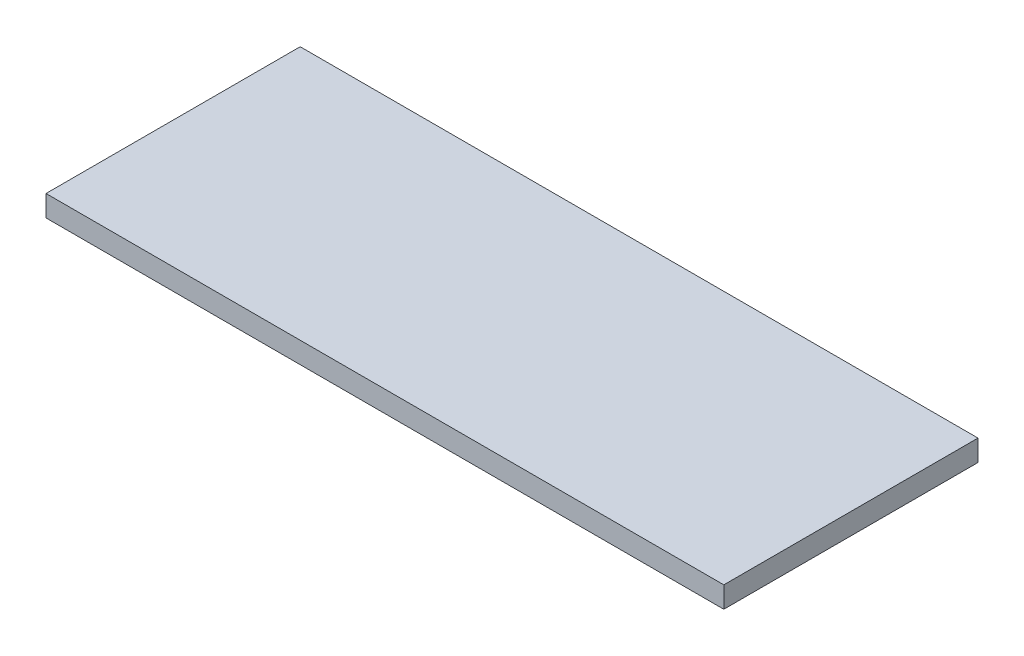
ISO-10303-21;
HEADER;
FILE_DESCRIPTION(('STEP AP214'),'2;1');
FILE_NAME('part.step','',(''),(''),'','','');
FILE_SCHEMA(('AUTOMOTIVE_DESIGN { 1 0 10303 214 1 1 1 1 }'));
ENDSEC;
DATA;
#1=APPLICATION_CONTEXT('core data for automotive mechanical design processes');
#2=APPLICATION_PROTOCOL_DEFINITION('international standard','automotive_design',2000,#1);
#3=PRODUCT_CONTEXT('',#1,'mechanical');
#4=PRODUCT('Part','Part','',(#3));
#5=PRODUCT_RELATED_PRODUCT_CATEGORY('part','',(#4));
#6=PRODUCT_DEFINITION_FORMATION('','',#4);
#7=PRODUCT_DEFINITION_CONTEXT('part definition',#1,'design');
#8=PRODUCT_DEFINITION('design','',#6,#7);
#9=PRODUCT_DEFINITION_SHAPE('','',#8);
#10=(LENGTH_UNIT() NAMED_UNIT(*) SI_UNIT(.MILLI.,.METRE.));
#11=(NAMED_UNIT(*) PLANE_ANGLE_UNIT() SI_UNIT($,.RADIAN.));
#12=(NAMED_UNIT(*) SI_UNIT($,.STERADIAN.) SOLID_ANGLE_UNIT());
#13=UNCERTAINTY_MEASURE_WITH_UNIT(LENGTH_MEASURE(1.E-05),#10,'distance_accuracy_value','');
#14=(GEOMETRIC_REPRESENTATION_CONTEXT(3) GLOBAL_UNCERTAINTY_ASSIGNED_CONTEXT((#13)) GLOBAL_UNIT_ASSIGNED_CONTEXT((#10,
#11,#12)) REPRESENTATION_CONTEXT('',''));
#15=CARTESIAN_POINT('',(0.,0.,0.));
#16=DIRECTION('',(0.,0.,1.));
#17=DIRECTION('',(1.,0.,0.));
#18=AXIS2_PLACEMENT_3D('',#15,#16,#17);
#19=CARTESIAN_POINT('',(0.,19.05,0.));
#20=DIRECTION('',(1.,0.,0.));
#21=DIRECTION('',(0.,0.,-1.));
#22=AXIS2_PLACEMENT_3D('',#19,#20,#21);
#23=PLANE('',#22);
#24=DIRECTION('',(0.,0.,1.));
#25=VECTOR('',#24,1.);
#26=CARTESIAN_POINT('',(0.,0.,0.));
#27=LINE('',#26,#25);
#28=CARTESIAN_POINT('',(1.11022302462516E-13,0.,-228.6));
#29=VERTEX_POINT('',#28);
#30=CARTESIAN_POINT('',(0.,0.,0.));
#31=VERTEX_POINT('',#30);
#32=EDGE_CURVE('E103',#29,#31,#27,.T.);
#33=ORIENTED_EDGE('',*,*,#32,.T.);
#34=DIRECTION('',(0.,-1.,0.));
#35=VECTOR('',#34,1.);
#36=CARTESIAN_POINT('',(0.,19.05,0.));
#37=LINE('',#36,#35);
#38=CARTESIAN_POINT('',(0.,19.05,0.));
#39=VERTEX_POINT('',#38);
#40=EDGE_CURVE('E11',#39,#31,#37,.T.);
#41=ORIENTED_EDGE('',*,*,#40,.F.);
#42=DIRECTION('',(0.,0.,1.));
#43=VECTOR('',#42,1.);
#44=CARTESIAN_POINT('',(0.,19.05,0.));
#45=LINE('',#44,#43);
#46=CARTESIAN_POINT('',(1.11022302462516E-13,19.05,-228.6));
#47=VERTEX_POINT('',#46);
#48=EDGE_CURVE('E86',#47,#39,#45,.T.);
#49=ORIENTED_EDGE('',*,*,#48,.F.);
#50=DIRECTION('',(0.,-1.,0.));
#51=VECTOR('',#50,1.);
#52=CARTESIAN_POINT('',(1.11022302462516E-13,19.05,-228.6));
#53=LINE('',#52,#51);
#54=EDGE_CURVE('E99',#47,#29,#53,.T.);
#55=ORIENTED_EDGE('',*,*,#54,.T.);
#56=EDGE_LOOP('',(#33,#41,#49,#55));
#57=FACE_BOUND('',#56,.T.);
#58=ADVANCED_FACE('F35',(#57),#23,.F.);
#59=CARTESIAN_POINT('',(0.,19.05,0.));
#60=DIRECTION('',(0.,0.,-1.));
#61=DIRECTION('',(-1.,0.,0.));
#62=AXIS2_PLACEMENT_3D('',#59,#60,#61);
#63=PLANE('',#62);
#64=DIRECTION('',(1.,0.,0.));
#65=VECTOR('',#64,1.);
#66=CARTESIAN_POINT('',(0.,0.,0.));
#67=LINE('',#66,#65);
#68=CARTESIAN_POINT('',(609.6,0.,0.));
#69=VERTEX_POINT('',#68);
#70=EDGE_CURVE('E91',#31,#69,#67,.T.);
#71=ORIENTED_EDGE('',*,*,#70,.T.);
#72=DIRECTION('',(0.,-1.,0.));
#73=VECTOR('',#72,1.);
#74=CARTESIAN_POINT('',(609.6,19.05,0.));
#75=LINE('',#74,#73);
#76=CARTESIAN_POINT('',(609.6,19.05,0.));
#77=VERTEX_POINT('',#76);
#78=EDGE_CURVE('E43',#77,#69,#75,.T.);
#79=ORIENTED_EDGE('',*,*,#78,.F.);
#80=DIRECTION('',(1.,0.,0.));
#81=VECTOR('',#80,1.);
#82=CARTESIAN_POINT('',(0.,19.05,0.));
#83=LINE('',#82,#81);
#84=EDGE_CURVE('E81',#39,#77,#83,.T.);
#85=ORIENTED_EDGE('',*,*,#84,.F.);
#86=ORIENTED_EDGE('',*,*,#40,.T.);
#87=EDGE_LOOP('',(#71,#79,#85,#86));
#88=FACE_BOUND('',#87,.T.);
#89=ADVANCED_FACE('F90',(#88),#63,.F.);
#90=CARTESIAN_POINT('',(609.6,19.05,0.));
#91=DIRECTION('',(-1.,0.,0.));
#92=DIRECTION('',(0.,0.,1.));
#93=AXIS2_PLACEMENT_3D('',#90,#91,#92);
#94=PLANE('',#93);
#95=DIRECTION('',(0.,0.,-1.));
#96=VECTOR('',#95,1.);
#97=CARTESIAN_POINT('',(609.6,0.,0.));
#98=LINE('',#97,#96);
#99=CARTESIAN_POINT('',(609.6,0.,-228.6));
#100=VERTEX_POINT('',#99);
#101=EDGE_CURVE('E68',#69,#100,#98,.T.);
#102=ORIENTED_EDGE('',*,*,#101,.T.);
#103=DIRECTION('',(0.,-1.,0.));
#104=VECTOR('',#103,1.);
#105=CARTESIAN_POINT('',(609.6,19.05,-228.6));
#106=LINE('',#105,#104);
#107=CARTESIAN_POINT('',(609.6,19.05,-228.6));
#108=VERTEX_POINT('',#107);
#109=EDGE_CURVE('E93',#108,#100,#106,.T.);
#110=ORIENTED_EDGE('',*,*,#109,.F.);
#111=DIRECTION('',(0.,0.,-1.));
#112=VECTOR('',#111,1.);
#113=CARTESIAN_POINT('',(609.6,19.05,0.));
#114=LINE('',#113,#112);
#115=EDGE_CURVE('E84',#77,#108,#114,.T.);
#116=ORIENTED_EDGE('',*,*,#115,.F.);
#117=ORIENTED_EDGE('',*,*,#78,.T.);
#118=EDGE_LOOP('',(#102,#110,#116,#117));
#119=FACE_BOUND('',#118,.T.);
#120=ADVANCED_FACE('F94',(#119),#94,.F.);
#121=CARTESIAN_POINT('',(1.11022302462516E-13,19.05,-228.6));
#122=DIRECTION('',(0.,0.,1.));
#123=DIRECTION('',(1.,0.,0.));
#124=AXIS2_PLACEMENT_3D('',#121,#122,#123);
#125=PLANE('',#124);
#126=DIRECTION('',(-1.,0.,0.));
#127=VECTOR('',#126,1.);
#128=CARTESIAN_POINT('',(1.11022302462516E-13,0.,-228.6));
#129=LINE('',#128,#127);
#130=EDGE_CURVE('E74',#100,#29,#129,.T.);
#131=ORIENTED_EDGE('',*,*,#130,.T.);
#132=ORIENTED_EDGE('',*,*,#54,.F.);
#133=DIRECTION('',(-1.,0.,0.));
#134=VECTOR('',#133,1.);
#135=CARTESIAN_POINT('',(1.11022302462516E-13,19.05,-228.6));
#136=LINE('',#135,#134);
#137=EDGE_CURVE('E51',#108,#47,#136,.T.);
#138=ORIENTED_EDGE('',*,*,#137,.F.);
#139=ORIENTED_EDGE('',*,*,#109,.T.);
#140=EDGE_LOOP('',(#131,#132,#138,#139));
#141=FACE_BOUND('',#140,.T.);
#142=ADVANCED_FACE('F112',(#141),#125,.F.);
#143=CARTESIAN_POINT('',(0.,19.05,0.));
#144=DIRECTION('',(0.,-1.,0.));
#145=DIRECTION('',(0.,0.,-1.));
#146=AXIS2_PLACEMENT_3D('',#143,#144,#145);
#147=PLANE('',#146);
#148=ORIENTED_EDGE('',*,*,#48,.T.);
#149=ORIENTED_EDGE('',*,*,#84,.T.);
#150=ORIENTED_EDGE('',*,*,#115,.T.);
#151=ORIENTED_EDGE('',*,*,#137,.T.);
#152=EDGE_LOOP('',(#148,#149,#150,#151));
#153=FACE_BOUND('',#152,.T.);
#154=ADVANCED_FACE('F82',(#153),#147,.F.);
#155=CARTESIAN_POINT('',(0.,0.,0.));
#156=DIRECTION('',(0.,-1.,0.));
#157=DIRECTION('',(0.,0.,-1.));
#158=AXIS2_PLACEMENT_3D('',#155,#156,#157);
#159=PLANE('',#158);
#160=ORIENTED_EDGE('',*,*,#32,.F.);
#161=ORIENTED_EDGE('',*,*,#130,.F.);
#162=ORIENTED_EDGE('',*,*,#101,.F.);
#163=ORIENTED_EDGE('',*,*,#70,.F.);
#164=EDGE_LOOP('',(#160,#161,#162,#163));
#165=FACE_BOUND('',#164,.T.);
#166=ADVANCED_FACE('F115',(#165),#159,.T.);
#167=CLOSED_SHELL('',(#58,#89,#120,#142,#154,#166));
#168=MANIFOLD_SOLID_BREP('B2',#167);
#169=ADVANCED_BREP_SHAPE_REPRESENTATION('',(#18,#168),#14);
#170=SHAPE_DEFINITION_REPRESENTATION(#9,#169);
ENDSEC;
END-ISO-10303-21;
